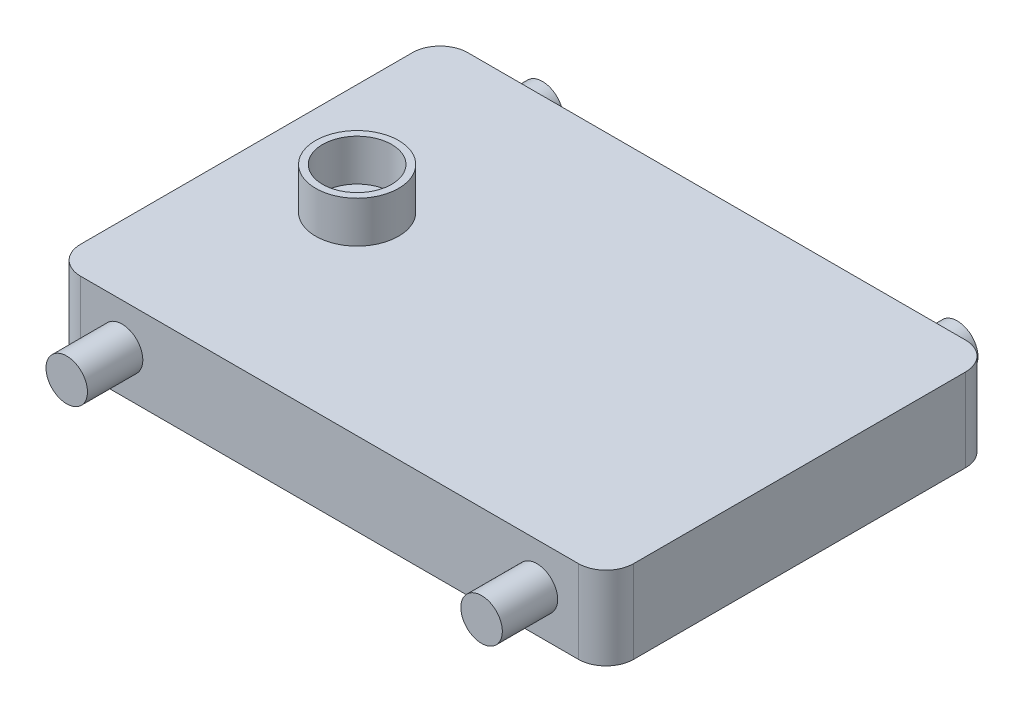
ISO-10303-21;
HEADER;
FILE_DESCRIPTION(('STEP AP214'),'2;1');
FILE_NAME('part.step','',(''),(''),'','','');
FILE_SCHEMA(('AUTOMOTIVE_DESIGN { 1 0 10303 214 1 1 1 1 }'));
ENDSEC;
DATA;
#1=APPLICATION_CONTEXT('core data for automotive mechanical design processes');
#2=APPLICATION_PROTOCOL_DEFINITION('international standard','automotive_design',2000,#1);
#3=PRODUCT_CONTEXT('',#1,'mechanical');
#4=PRODUCT('Part','Part','',(#3));
#5=PRODUCT_RELATED_PRODUCT_CATEGORY('part','',(#4));
#6=PRODUCT_DEFINITION_FORMATION('','',#4);
#7=PRODUCT_DEFINITION_CONTEXT('part definition',#1,'design');
#8=PRODUCT_DEFINITION('design','',#6,#7);
#9=PRODUCT_DEFINITION_SHAPE('','',#8);
#10=(LENGTH_UNIT() NAMED_UNIT(*) SI_UNIT(.MILLI.,.METRE.));
#11=(NAMED_UNIT(*) PLANE_ANGLE_UNIT() SI_UNIT($,.RADIAN.));
#12=(NAMED_UNIT(*) SI_UNIT($,.STERADIAN.) SOLID_ANGLE_UNIT());
#13=UNCERTAINTY_MEASURE_WITH_UNIT(LENGTH_MEASURE(1.E-05),#10,'distance_accuracy_value','');
#14=(GEOMETRIC_REPRESENTATION_CONTEXT(3) GLOBAL_UNCERTAINTY_ASSIGNED_CONTEXT((#13)) GLOBAL_UNIT_ASSIGNED_CONTEXT((#10,
#11,#12)) REPRESENTATION_CONTEXT('',''));
#15=CARTESIAN_POINT('',(0.,0.,0.));
#16=DIRECTION('',(0.,0.,1.));
#17=DIRECTION('',(1.,0.,0.));
#18=AXIS2_PLACEMENT_3D('',#15,#16,#17);
#19=CARTESIAN_POINT('',(100.,30.,70.));
#20=DIRECTION('',(-1.,0.,0.));
#21=DIRECTION('',(0.,0.,1.));
#22=AXIS2_PLACEMENT_3D('',#19,#20,#21);
#23=PLANE('',#22);
#24=DIRECTION('',(0.,0.,-1.));
#25=VECTOR('',#24,1.);
#26=CARTESIAN_POINT('',(100.,0.,70.));
#27=LINE('',#26,#25);
#28=CARTESIAN_POINT('',(100.,0.,60.));
#29=VERTEX_POINT('',#28);
#30=CARTESIAN_POINT('',(100.,0.,-60.));
#31=VERTEX_POINT('',#30);
#32=EDGE_CURVE('E128',#29,#31,#27,.T.);
#33=ORIENTED_EDGE('',*,*,#32,.T.);
#34=DIRECTION('',(0.,-1.,0.));
#35=VECTOR('',#34,1.);
#36=CARTESIAN_POINT('',(100.,30.,-60.));
#37=LINE('',#36,#35);
#38=CARTESIAN_POINT('',(100.,30.,-60.));
#39=VERTEX_POINT('',#38);
#40=EDGE_CURVE('E106',#31,#39,#37,.F.);
#41=ORIENTED_EDGE('',*,*,#40,.T.);
#42=DIRECTION('',(0.,0.,-1.));
#43=VECTOR('',#42,1.);
#44=CARTESIAN_POINT('',(100.,30.,70.));
#45=LINE('',#44,#43);
#46=CARTESIAN_POINT('',(100.,30.,60.));
#47=VERTEX_POINT('',#46);
#48=EDGE_CURVE('E138',#47,#39,#45,.T.);
#49=ORIENTED_EDGE('',*,*,#48,.F.);
#50=DIRECTION('',(0.,-1.,0.));
#51=VECTOR('',#50,1.);
#52=CARTESIAN_POINT('',(100.,30.,60.));
#53=LINE('',#52,#51);
#54=EDGE_CURVE('E111',#47,#29,#53,.T.);
#55=ORIENTED_EDGE('',*,*,#54,.T.);
#56=EDGE_LOOP('',(#33,#41,#49,#55));
#57=FACE_BOUND('',#56,.T.);
#58=ADVANCED_FACE('F33',(#57),#23,.F.);
#59=CARTESIAN_POINT('',(-100.,30.,-70.));
#60=DIRECTION('',(0.,0.,1.));
#61=DIRECTION('',(1.,0.,0.));
#62=AXIS2_PLACEMENT_3D('',#59,#60,#61);
#63=PLANE('',#62);
#64=CARTESIAN_POINT('',(-75.,15.0000000000002,-70.));
#65=DIRECTION('',(0.,0.,1.));
#66=DIRECTION('',(1.,0.,0.));
#67=AXIS2_PLACEMENT_3D('',#64,#65,#66);
#68=CIRCLE('',#67,7.50000000000001);
#69=CARTESIAN_POINT('',(-67.4999999999999,15.0000000000002,-70.));
#70=VERTEX_POINT('',#69);
#71=EDGE_CURVE('E37',#70,#70,#68,.F.);
#72=ORIENTED_EDGE('',*,*,#71,.F.);
#73=EDGE_LOOP('',(#72));
#74=FACE_BOUND('',#73,.T.);
#75=CARTESIAN_POINT('',(75.,15.,-70.));
#76=DIRECTION('',(0.,0.,1.));
#77=DIRECTION('',(1.,0.,0.));
#78=AXIS2_PLACEMENT_3D('',#75,#76,#77);
#79=CIRCLE('',#78,7.50000000000001);
#80=CARTESIAN_POINT('',(82.5,15.,-70.));
#81=VERTEX_POINT('',#80);
#82=EDGE_CURVE('E169',#81,#81,#79,.F.);
#83=ORIENTED_EDGE('',*,*,#82,.F.);
#84=EDGE_LOOP('',(#83));
#85=FACE_BOUND('',#84,.T.);
#86=DIRECTION('',(-1.,0.,0.));
#87=VECTOR('',#86,1.);
#88=CARTESIAN_POINT('',(-100.,30.,-70.));
#89=LINE('',#88,#87);
#90=CARTESIAN_POINT('',(90.,30.,-70.));
#91=VERTEX_POINT('',#90);
#92=CARTESIAN_POINT('',(-90.,30.,-70.));
#93=VERTEX_POINT('',#92);
#94=EDGE_CURVE('E121',#91,#93,#89,.T.);
#95=ORIENTED_EDGE('',*,*,#94,.F.);
#96=DIRECTION('',(0.,-1.,0.));
#97=VECTOR('',#96,1.);
#98=CARTESIAN_POINT('',(90.,30.,-70.));
#99=LINE('',#98,#97);
#100=CARTESIAN_POINT('',(90.,0.,-70.));
#101=VERTEX_POINT('',#100);
#102=EDGE_CURVE('E105',#91,#101,#99,.T.);
#103=ORIENTED_EDGE('',*,*,#102,.T.);
#104=DIRECTION('',(-1.,0.,0.));
#105=VECTOR('',#104,1.);
#106=CARTESIAN_POINT('',(-100.,0.,-70.));
#107=LINE('',#106,#105);
#108=CARTESIAN_POINT('',(-90.,0.,-70.));
#109=VERTEX_POINT('',#108);
#110=EDGE_CURVE('E118',#101,#109,#107,.T.);
#111=ORIENTED_EDGE('',*,*,#110,.T.);
#112=DIRECTION('',(0.,-1.,0.));
#113=VECTOR('',#112,1.);
#114=CARTESIAN_POINT('',(-90.,30.,-70.));
#115=LINE('',#114,#113);
#116=EDGE_CURVE('E123',#109,#93,#115,.F.);
#117=ORIENTED_EDGE('',*,*,#116,.T.);
#118=EDGE_LOOP('',(#95,#103,#111,#117));
#119=FACE_BOUND('',#118,.T.);
#120=ADVANCED_FACE('F117',(#74,#85,#119),#63,.F.);
#121=CARTESIAN_POINT('',(-100.,30.,70.));
#122=DIRECTION('',(1.,0.,0.));
#123=DIRECTION('',(0.,0.,-1.));
#124=AXIS2_PLACEMENT_3D('',#121,#122,#123);
#125=PLANE('',#124);
#126=DIRECTION('',(0.,0.,1.));
#127=VECTOR('',#126,1.);
#128=CARTESIAN_POINT('',(-100.,30.,70.));
#129=LINE('',#128,#127);
#130=CARTESIAN_POINT('',(-100.,30.,-60.));
#131=VERTEX_POINT('',#130);
#132=CARTESIAN_POINT('',(-100.,30.,60.));
#133=VERTEX_POINT('',#132);
#134=EDGE_CURVE('E214',#131,#133,#129,.T.);
#135=ORIENTED_EDGE('',*,*,#134,.F.);
#136=DIRECTION('',(0.,-1.,0.));
#137=VECTOR('',#136,1.);
#138=CARTESIAN_POINT('',(-100.,30.,-60.));
#139=LINE('',#138,#137);
#140=CARTESIAN_POINT('',(-100.,0.,-60.));
#141=VERTEX_POINT('',#140);
#142=EDGE_CURVE('E157',#131,#141,#139,.T.);
#143=ORIENTED_EDGE('',*,*,#142,.T.);
#144=DIRECTION('',(0.,0.,1.));
#145=VECTOR('',#144,1.);
#146=CARTESIAN_POINT('',(-100.,0.,70.));
#147=LINE('',#146,#145);
#148=CARTESIAN_POINT('',(-100.,0.,60.));
#149=VERTEX_POINT('',#148);
#150=EDGE_CURVE('E127',#141,#149,#147,.T.);
#151=ORIENTED_EDGE('',*,*,#150,.T.);
#152=DIRECTION('',(0.,-1.,0.));
#153=VECTOR('',#152,1.);
#154=CARTESIAN_POINT('',(-100.,30.,60.));
#155=LINE('',#154,#153);
#156=EDGE_CURVE('E155',#149,#133,#155,.F.);
#157=ORIENTED_EDGE('',*,*,#156,.T.);
#158=EDGE_LOOP('',(#135,#143,#151,#157));
#159=FACE_BOUND('',#158,.T.);
#160=ADVANCED_FACE('F180',(#159),#125,.F.);
#161=CARTESIAN_POINT('',(-100.,30.,70.));
#162=DIRECTION('',(0.,0.,-1.));
#163=DIRECTION('',(-1.,0.,0.));
#164=AXIS2_PLACEMENT_3D('',#161,#162,#163);
#165=PLANE('',#164);
#166=CARTESIAN_POINT('',(75.,15.0000000000001,70.));
#167=DIRECTION('',(0.,0.,-1.));
#168=DIRECTION('',(-1.,0.,0.));
#169=AXIS2_PLACEMENT_3D('',#166,#167,#168);
#170=CIRCLE('',#169,7.50000000000001);
#171=CARTESIAN_POINT('',(67.5,15.0000000000001,70.));
#172=VERTEX_POINT('',#171);
#173=EDGE_CURVE('E167',#172,#172,#170,.F.);
#174=ORIENTED_EDGE('',*,*,#173,.F.);
#175=EDGE_LOOP('',(#174));
#176=FACE_BOUND('',#175,.T.);
#177=CARTESIAN_POINT('',(-75.,15.,70.));
#178=DIRECTION('',(0.,0.,-1.));
#179=DIRECTION('',(-1.,0.,0.));
#180=AXIS2_PLACEMENT_3D('',#177,#178,#179);
#181=CIRCLE('',#180,7.50000000000001);
#182=CARTESIAN_POINT('',(-82.5,15.,70.));
#183=VERTEX_POINT('',#182);
#184=EDGE_CURVE('E164',#183,#183,#181,.F.);
#185=ORIENTED_EDGE('',*,*,#184,.F.);
#186=EDGE_LOOP('',(#185));
#187=FACE_BOUND('',#186,.T.);
#188=DIRECTION('',(1.,0.,0.));
#189=VECTOR('',#188,1.);
#190=CARTESIAN_POINT('',(-100.,30.,70.));
#191=LINE('',#190,#189);
#192=CARTESIAN_POINT('',(-90.,30.,70.));
#193=VERTEX_POINT('',#192);
#194=CARTESIAN_POINT('',(90.,30.,70.));
#195=VERTEX_POINT('',#194);
#196=EDGE_CURVE('E139',#193,#195,#191,.T.);
#197=ORIENTED_EDGE('',*,*,#196,.F.);
#198=DIRECTION('',(0.,-1.,0.));
#199=VECTOR('',#198,1.);
#200=CARTESIAN_POINT('',(-90.,30.,70.));
#201=LINE('',#200,#199);
#202=CARTESIAN_POINT('',(-90.,0.,70.));
#203=VERTEX_POINT('',#202);
#204=EDGE_CURVE('E161',#193,#203,#201,.T.);
#205=ORIENTED_EDGE('',*,*,#204,.T.);
#206=DIRECTION('',(1.,0.,0.));
#207=VECTOR('',#206,1.);
#208=CARTESIAN_POINT('',(-100.,0.,70.));
#209=LINE('',#208,#207);
#210=CARTESIAN_POINT('',(90.,0.,70.));
#211=VERTEX_POINT('',#210);
#212=EDGE_CURVE('E131',#203,#211,#209,.T.);
#213=ORIENTED_EDGE('',*,*,#212,.T.);
#214=DIRECTION('',(0.,-1.,0.));
#215=VECTOR('',#214,1.);
#216=CARTESIAN_POINT('',(90.,30.,70.));
#217=LINE('',#216,#215);
#218=EDGE_CURVE('E49',#211,#195,#217,.F.);
#219=ORIENTED_EDGE('',*,*,#218,.T.);
#220=EDGE_LOOP('',(#197,#205,#213,#219));
#221=FACE_BOUND('',#220,.T.);
#222=ADVANCED_FACE('F186',(#176,#187,#221),#165,.F.);
#223=CARTESIAN_POINT('',(0.,30.,0.));
#224=DIRECTION('',(0.,-1.,0.));
#225=DIRECTION('',(0.,0.,-1.));
#226=AXIS2_PLACEMENT_3D('',#223,#224,#225);
#227=PLANE('',#226);
#228=CARTESIAN_POINT('',(-60.,30.,0.));
#229=DIRECTION('',(0.,-1.,0.));
#230=DIRECTION('',(0.,0.,-1.));
#231=AXIS2_PLACEMENT_3D('',#228,#229,#230);
#232=CIRCLE('',#231,15.);
#233=CARTESIAN_POINT('',(-60.,30.,-15.));
#234=VERTEX_POINT('',#233);
#235=EDGE_CURVE('E299',#234,#234,#232,.T.);
#236=ORIENTED_EDGE('',*,*,#235,.T.);
#237=EDGE_LOOP('',(#236));
#238=FACE_BOUND('',#237,.T.);
#239=ORIENTED_EDGE('',*,*,#48,.T.);
#240=CARTESIAN_POINT('',(90.,30.,-60.));
#241=DIRECTION('',(0.,-1.,0.));
#242=DIRECTION('',(0.,0.,-1.));
#243=AXIS2_PLACEMENT_3D('',#240,#241,#242);
#244=CIRCLE('',#243,10.);
#245=EDGE_CURVE('E153',#39,#91,#244,.F.);
#246=ORIENTED_EDGE('',*,*,#245,.T.);
#247=ORIENTED_EDGE('',*,*,#94,.T.);
#248=CARTESIAN_POINT('',(-90.,30.,-60.));
#249=DIRECTION('',(0.,-1.,0.));
#250=DIRECTION('',(0.,0.,-1.));
#251=AXIS2_PLACEMENT_3D('',#248,#249,#250);
#252=CIRCLE('',#251,10.);
#253=EDGE_CURVE('E151',#93,#131,#252,.F.);
#254=ORIENTED_EDGE('',*,*,#253,.T.);
#255=ORIENTED_EDGE('',*,*,#134,.T.);
#256=CARTESIAN_POINT('',(-90.,30.,60.));
#257=DIRECTION('',(0.,-1.,0.));
#258=DIRECTION('',(0.,0.,-1.));
#259=AXIS2_PLACEMENT_3D('',#256,#257,#258);
#260=CIRCLE('',#259,10.);
#261=EDGE_CURVE('E56',#133,#193,#260,.F.);
#262=ORIENTED_EDGE('',*,*,#261,.T.);
#263=ORIENTED_EDGE('',*,*,#196,.T.);
#264=CARTESIAN_POINT('',(90.,30.,60.));
#265=DIRECTION('',(0.,-1.,0.));
#266=DIRECTION('',(0.,0.,-1.));
#267=AXIS2_PLACEMENT_3D('',#264,#265,#266);
#268=CIRCLE('',#267,10.);
#269=EDGE_CURVE('E148',#195,#47,#268,.F.);
#270=ORIENTED_EDGE('',*,*,#269,.T.);
#271=EDGE_LOOP('',(#239,#246,#247,#254,#255,#262,#263,#270));
#272=FACE_BOUND('',#271,.T.);
#273=ADVANCED_FACE('F219',(#238,#272),#227,.F.);
#274=CARTESIAN_POINT('',(0.,0.,0.));
#275=DIRECTION('',(0.,-1.,0.));
#276=DIRECTION('',(0.,0.,-1.));
#277=AXIS2_PLACEMENT_3D('',#274,#275,#276);
#278=PLANE('',#277);
#279=ORIENTED_EDGE('',*,*,#110,.F.);
#280=CARTESIAN_POINT('',(90.,0.,-60.));
#281=DIRECTION('',(0.,-1.,0.));
#282=DIRECTION('',(0.,0.,-1.));
#283=AXIS2_PLACEMENT_3D('',#280,#281,#282);
#284=CIRCLE('',#283,10.);
#285=EDGE_CURVE('E101',#101,#31,#284,.T.);
#286=ORIENTED_EDGE('',*,*,#285,.T.);
#287=ORIENTED_EDGE('',*,*,#32,.F.);
#288=CARTESIAN_POINT('',(90.,0.,60.));
#289=DIRECTION('',(0.,-1.,0.));
#290=DIRECTION('',(0.,0.,-1.));
#291=AXIS2_PLACEMENT_3D('',#288,#289,#290);
#292=CIRCLE('',#291,10.);
#293=EDGE_CURVE('E122',#29,#211,#292,.T.);
#294=ORIENTED_EDGE('',*,*,#293,.T.);
#295=ORIENTED_EDGE('',*,*,#212,.F.);
#296=CARTESIAN_POINT('',(-90.,0.,60.));
#297=DIRECTION('',(0.,-1.,0.));
#298=DIRECTION('',(0.,0.,-1.));
#299=AXIS2_PLACEMENT_3D('',#296,#297,#298);
#300=CIRCLE('',#299,10.);
#301=EDGE_CURVE('E142',#203,#149,#300,.T.);
#302=ORIENTED_EDGE('',*,*,#301,.T.);
#303=ORIENTED_EDGE('',*,*,#150,.F.);
#304=CARTESIAN_POINT('',(-90.,0.,-60.));
#305=DIRECTION('',(0.,-1.,0.));
#306=DIRECTION('',(0.,0.,-1.));
#307=AXIS2_PLACEMENT_3D('',#304,#305,#306);
#308=CIRCLE('',#307,10.);
#309=EDGE_CURVE('E112',#141,#109,#308,.T.);
#310=ORIENTED_EDGE('',*,*,#309,.T.);
#311=EDGE_LOOP('',(#279,#286,#287,#294,#295,#302,#303,#310));
#312=FACE_BOUND('',#311,.T.);
#313=ADVANCED_FACE('F125',(#312),#278,.T.);
#314=CARTESIAN_POINT('',(90.,30.,-60.));
#315=DIRECTION('',(0.,-1.,0.));
#316=DIRECTION('',(0.,0.,-1.));
#317=AXIS2_PLACEMENT_3D('',#314,#315,#316);
#318=CYLINDRICAL_SURFACE('',#317,10.);
#319=ORIENTED_EDGE('',*,*,#245,.F.);
#320=ORIENTED_EDGE('',*,*,#40,.F.);
#321=ORIENTED_EDGE('',*,*,#285,.F.);
#322=ORIENTED_EDGE('',*,*,#102,.F.);
#323=EDGE_LOOP('',(#319,#320,#321,#322));
#324=FACE_BOUND('',#323,.T.);
#325=ADVANCED_FACE('F104',(#324),#318,.T.);
#326=CARTESIAN_POINT('',(-90.,30.,-60.));
#327=DIRECTION('',(0.,-1.,0.));
#328=DIRECTION('',(0.,0.,-1.));
#329=AXIS2_PLACEMENT_3D('',#326,#327,#328);
#330=CYLINDRICAL_SURFACE('',#329,10.);
#331=ORIENTED_EDGE('',*,*,#253,.F.);
#332=ORIENTED_EDGE('',*,*,#116,.F.);
#333=ORIENTED_EDGE('',*,*,#309,.F.);
#334=ORIENTED_EDGE('',*,*,#142,.F.);
#335=EDGE_LOOP('',(#331,#332,#333,#334));
#336=FACE_BOUND('',#335,.T.);
#337=ADVANCED_FACE('F195',(#336),#330,.T.);
#338=CARTESIAN_POINT('',(-90.,30.,60.));
#339=DIRECTION('',(0.,-1.,0.));
#340=DIRECTION('',(0.,0.,-1.));
#341=AXIS2_PLACEMENT_3D('',#338,#339,#340);
#342=CYLINDRICAL_SURFACE('',#341,10.);
#343=ORIENTED_EDGE('',*,*,#261,.F.);
#344=ORIENTED_EDGE('',*,*,#156,.F.);
#345=ORIENTED_EDGE('',*,*,#301,.F.);
#346=ORIENTED_EDGE('',*,*,#204,.F.);
#347=EDGE_LOOP('',(#343,#344,#345,#346));
#348=FACE_BOUND('',#347,.T.);
#349=ADVANCED_FACE('F197',(#348),#342,.T.);
#350=CARTESIAN_POINT('',(90.,30.,60.));
#351=DIRECTION('',(0.,-1.,0.));
#352=DIRECTION('',(0.,0.,-1.));
#353=AXIS2_PLACEMENT_3D('',#350,#351,#352);
#354=CYLINDRICAL_SURFACE('',#353,10.);
#355=ORIENTED_EDGE('',*,*,#269,.F.);
#356=ORIENTED_EDGE('',*,*,#218,.F.);
#357=ORIENTED_EDGE('',*,*,#293,.F.);
#358=ORIENTED_EDGE('',*,*,#54,.F.);
#359=EDGE_LOOP('',(#355,#356,#357,#358));
#360=FACE_BOUND('',#359,.T.);
#361=ADVANCED_FACE('F35',(#360),#354,.T.);
#362=CARTESIAN_POINT('',(-75.,15.,90.));
#363=DIRECTION('',(0.,0.,-1.));
#364=DIRECTION('',(-1.,0.,0.));
#365=AXIS2_PLACEMENT_3D('',#362,#363,#364);
#366=CYLINDRICAL_SURFACE('',#365,7.50000000000001);
#367=CARTESIAN_POINT('',(-75.,15.,90.));
#368=DIRECTION('',(0.,0.,1.));
#369=DIRECTION('',(1.,0.,0.));
#370=AXIS2_PLACEMENT_3D('',#367,#368,#369);
#371=CIRCLE('',#370,7.50000000000001);
#372=CARTESIAN_POINT('',(-67.5,15.,90.));
#373=VERTEX_POINT('',#372);
#374=EDGE_CURVE('E133',#373,#373,#371,.T.);
#375=ORIENTED_EDGE('',*,*,#374,.F.);
#376=EDGE_LOOP('',(#375));
#377=FACE_BOUND('',#376,.T.);
#378=ORIENTED_EDGE('',*,*,#184,.T.);
#379=EDGE_LOOP('',(#378));
#380=FACE_BOUND('',#379,.T.);
#381=ADVANCED_FACE('F204',(#377,#380),#366,.T.);
#382=CARTESIAN_POINT('',(-75.,15.,90.));
#383=DIRECTION('',(0.,0.,1.));
#384=DIRECTION('',(1.,0.,0.));
#385=AXIS2_PLACEMENT_3D('',#382,#383,#384);
#386=PLANE('',#385);
#387=ORIENTED_EDGE('',*,*,#374,.T.);
#388=EDGE_LOOP('',(#387));
#389=FACE_BOUND('',#388,.T.);
#390=ADVANCED_FACE('F276',(#389),#386,.T.);
#391=CARTESIAN_POINT('',(75.,15.0000000000001,90.));
#392=DIRECTION('',(0.,0.,-1.));
#393=DIRECTION('',(-1.,0.,0.));
#394=AXIS2_PLACEMENT_3D('',#391,#392,#393);
#395=CYLINDRICAL_SURFACE('',#394,7.50000000000001);
#396=CARTESIAN_POINT('',(75.,15.0000000000001,90.));
#397=DIRECTION('',(0.,0.,1.));
#398=DIRECTION('',(-1.,0.,0.));
#399=AXIS2_PLACEMENT_3D('',#396,#397,#398);
#400=CIRCLE('',#399,7.50000000000001);
#401=CARTESIAN_POINT('',(67.5,15.0000000000001,90.));
#402=VERTEX_POINT('',#401);
#403=EDGE_CURVE('E289',#402,#402,#400,.T.);
#404=ORIENTED_EDGE('',*,*,#403,.F.);
#405=EDGE_LOOP('',(#404));
#406=FACE_BOUND('',#405,.T.);
#407=ORIENTED_EDGE('',*,*,#173,.T.);
#408=EDGE_LOOP('',(#407));
#409=FACE_BOUND('',#408,.T.);
#410=ADVANCED_FACE('F272',(#406,#409),#395,.T.);
#411=CARTESIAN_POINT('',(75.,15.0000000000001,90.));
#412=DIRECTION('',(0.,0.,-1.));
#413=DIRECTION('',(-1.,0.,0.));
#414=AXIS2_PLACEMENT_3D('',#411,#412,#413);
#415=PLANE('',#414);
#416=ORIENTED_EDGE('',*,*,#403,.T.);
#417=EDGE_LOOP('',(#416));
#418=FACE_BOUND('',#417,.T.);
#419=ADVANCED_FACE('F268',(#418),#415,.F.);
#420=CARTESIAN_POINT('',(75.,15.,-82.));
#421=DIRECTION('',(0.,0.,1.));
#422=DIRECTION('',(1.,0.,0.));
#423=AXIS2_PLACEMENT_3D('',#420,#421,#422);
#424=CYLINDRICAL_SURFACE('',#423,7.50000000000001);
#425=CARTESIAN_POINT('',(75.,15.,-82.));
#426=DIRECTION('',(0.,0.,-1.));
#427=DIRECTION('',(-1.,0.,0.));
#428=AXIS2_PLACEMENT_3D('',#425,#426,#427);
#429=CIRCLE('',#428,7.50000000000001);
#430=CARTESIAN_POINT('',(67.5,15.,-82.));
#431=VERTEX_POINT('',#430);
#432=EDGE_CURVE('E291',#431,#431,#429,.T.);
#433=ORIENTED_EDGE('',*,*,#432,.F.);
#434=EDGE_LOOP('',(#433));
#435=FACE_BOUND('',#434,.T.);
#436=ORIENTED_EDGE('',*,*,#82,.T.);
#437=EDGE_LOOP('',(#436));
#438=FACE_BOUND('',#437,.T.);
#439=ADVANCED_FACE('F264',(#435,#438),#424,.T.);
#440=CARTESIAN_POINT('',(75.,15.,-82.));
#441=DIRECTION('',(0.,0.,-1.));
#442=DIRECTION('',(-1.,0.,0.));
#443=AXIS2_PLACEMENT_3D('',#440,#441,#442);
#444=PLANE('',#443);
#445=ORIENTED_EDGE('',*,*,#432,.T.);
#446=EDGE_LOOP('',(#445));
#447=FACE_BOUND('',#446,.T.);
#448=ADVANCED_FACE('F260',(#447),#444,.T.);
#449=CARTESIAN_POINT('',(-75.,15.0000000000002,-82.));
#450=DIRECTION('',(0.,0.,1.));
#451=DIRECTION('',(1.,0.,0.));
#452=AXIS2_PLACEMENT_3D('',#449,#450,#451);
#453=CYLINDRICAL_SURFACE('',#452,7.50000000000001);
#454=CARTESIAN_POINT('',(-75.,15.0000000000002,-82.));
#455=DIRECTION('',(0.,0.,-1.));
#456=DIRECTION('',(1.,0.,0.));
#457=AXIS2_PLACEMENT_3D('',#454,#455,#456);
#458=CIRCLE('',#457,7.50000000000001);
#459=CARTESIAN_POINT('',(-67.4999999999999,15.0000000000002,-82.));
#460=VERTEX_POINT('',#459);
#461=EDGE_CURVE('E294',#460,#460,#458,.T.);
#462=ORIENTED_EDGE('',*,*,#461,.F.);
#463=EDGE_LOOP('',(#462));
#464=FACE_BOUND('',#463,.T.);
#465=ORIENTED_EDGE('',*,*,#71,.T.);
#466=EDGE_LOOP('',(#465));
#467=FACE_BOUND('',#466,.T.);
#468=ADVANCED_FACE('F176',(#464,#467),#453,.T.);
#469=CARTESIAN_POINT('',(-75.,15.0000000000002,-82.));
#470=DIRECTION('',(0.,0.,1.));
#471=DIRECTION('',(1.,0.,0.));
#472=AXIS2_PLACEMENT_3D('',#469,#470,#471);
#473=PLANE('',#472);
#474=ORIENTED_EDGE('',*,*,#461,.T.);
#475=EDGE_LOOP('',(#474));
#476=FACE_BOUND('',#475,.T.);
#477=ADVANCED_FACE('F250',(#476),#473,.F.);
#478=CARTESIAN_POINT('',(-60.,45.,0.));
#479=DIRECTION('',(0.,-1.,0.));
#480=DIRECTION('',(0.,0.,-1.));
#481=AXIS2_PLACEMENT_3D('',#478,#479,#480);
#482=CYLINDRICAL_SURFACE('',#481,15.);
#483=CARTESIAN_POINT('',(-60.,45.,0.));
#484=DIRECTION('',(0.,-1.,0.));
#485=DIRECTION('',(0.,0.,-1.));
#486=AXIS2_PLACEMENT_3D('',#483,#484,#485);
#487=CIRCLE('',#486,15.);
#488=CARTESIAN_POINT('',(-60.,45.,-15.));
#489=VERTEX_POINT('',#488);
#490=EDGE_CURVE('E300',#489,#489,#487,.T.);
#491=CARTESIAN_POINT('',(-60.,45.,-15.));
#492=CARTESIAN_POINT('',(-60.,44.84375,-15.));
#493=CARTESIAN_POINT('',(-60.,44.6875,-15.));
#494=CARTESIAN_POINT('',(-60.,44.375,-15.));
#495=CARTESIAN_POINT('',(-60.,44.21875,-15.));
#496=CARTESIAN_POINT('',(-60.,43.90625,-15.));
#497=CARTESIAN_POINT('',(-60.,43.75,-15.));
#498=CARTESIAN_POINT('',(-60.,43.4375,-15.));
#499=CARTESIAN_POINT('',(-60.,43.28125,-15.));
#500=CARTESIAN_POINT('',(-60.,42.96875,-15.));
#501=CARTESIAN_POINT('',(-60.,42.8125,-15.));
#502=CARTESIAN_POINT('',(-60.,42.5,-15.));
#503=CARTESIAN_POINT('',(-60.,42.34375,-15.));
#504=CARTESIAN_POINT('',(-60.,42.03125,-15.));
#505=CARTESIAN_POINT('',(-60.,41.875,-15.));
#506=CARTESIAN_POINT('',(-60.,41.5625,-15.));
#507=CARTESIAN_POINT('',(-60.,41.40625,-15.));
#508=CARTESIAN_POINT('',(-60.,41.09375,-15.));
#509=CARTESIAN_POINT('',(-60.,40.9375,-15.));
#510=CARTESIAN_POINT('',(-60.,40.625,-15.));
#511=CARTESIAN_POINT('',(-60.,40.46875,-15.));
#512=CARTESIAN_POINT('',(-60.,40.15625,-15.));
#513=CARTESIAN_POINT('',(-60.,40.,-15.));
#514=CARTESIAN_POINT('',(-60.,39.6875,-15.));
#515=CARTESIAN_POINT('',(-60.,39.53125,-15.));
#516=CARTESIAN_POINT('',(-60.,39.21875,-15.));
#517=CARTESIAN_POINT('',(-60.,39.0625,-15.));
#518=CARTESIAN_POINT('',(-60.,38.75,-15.));
#519=CARTESIAN_POINT('',(-60.,38.59375,-15.));
#520=CARTESIAN_POINT('',(-60.,38.28125,-15.));
#521=CARTESIAN_POINT('',(-60.,38.125,-15.));
#522=CARTESIAN_POINT('',(-60.,37.8125,-15.));
#523=CARTESIAN_POINT('',(-60.,37.65625,-15.));
#524=CARTESIAN_POINT('',(-60.,37.34375,-15.));
#525=CARTESIAN_POINT('',(-60.,37.1875,-15.));
#526=CARTESIAN_POINT('',(-60.,36.875,-15.));
#527=CARTESIAN_POINT('',(-60.,36.71875,-15.));
#528=CARTESIAN_POINT('',(-60.,36.40625,-15.));
#529=CARTESIAN_POINT('',(-60.,36.25,-15.));
#530=CARTESIAN_POINT('',(-60.,35.9375,-15.));
#531=CARTESIAN_POINT('',(-60.,35.78125,-15.));
#532=CARTESIAN_POINT('',(-60.,35.46875,-15.));
#533=CARTESIAN_POINT('',(-60.,35.3125,-15.));
#534=CARTESIAN_POINT('',(-60.,35.,-15.));
#535=CARTESIAN_POINT('',(-60.,34.84375,-15.));
#536=CARTESIAN_POINT('',(-60.,34.53125,-15.));
#537=CARTESIAN_POINT('',(-60.,34.375,-15.));
#538=CARTESIAN_POINT('',(-60.,34.0625,-15.));
#539=CARTESIAN_POINT('',(-60.,33.90625,-15.));
#540=CARTESIAN_POINT('',(-60.,33.59375,-15.));
#541=CARTESIAN_POINT('',(-60.,33.4375,-15.));
#542=CARTESIAN_POINT('',(-60.,33.125,-15.));
#543=CARTESIAN_POINT('',(-60.,32.96875,-15.));
#544=CARTESIAN_POINT('',(-60.,32.65625,-15.));
#545=CARTESIAN_POINT('',(-60.,32.5,-15.));
#546=CARTESIAN_POINT('',(-60.,32.1875,-15.));
#547=CARTESIAN_POINT('',(-60.,32.03125,-15.));
#548=CARTESIAN_POINT('',(-60.,31.71875,-15.));
#549=CARTESIAN_POINT('',(-60.,31.5625,-15.));
#550=CARTESIAN_POINT('',(-60.,31.25,-15.));
#551=CARTESIAN_POINT('',(-60.,31.09375,-15.));
#552=CARTESIAN_POINT('',(-60.,30.78125,-15.));
#553=CARTESIAN_POINT('',(-60.,30.625,-15.));
#554=CARTESIAN_POINT('',(-60.,30.3125,-15.));
#555=CARTESIAN_POINT('',(-60.,30.15625,-15.));
#556=CARTESIAN_POINT('',(-60.,30.,-15.));
#557=B_SPLINE_CURVE_WITH_KNOTS('',3,(#491,#492,#493,#494,#495,#496,#497,#498,#499,#500,#501,
#502,#503,#504,#505,#506,#507,#508,#509,#510,#511,#512,#513,#514,#515,#516,#517,#518,#519,#520,
#521,#522,#523,#524,#525,#526,#527,#528,#529,#530,#531,#532,#533,#534,#535,#536,#537,#538,#539,
#540,#541,#542,#543,#544,#545,#546,#547,#548,#549,#550,#551,#552,#553,#554,#555,#556),
.UNSPECIFIED.,.F.,.F.,(4,2,2,2,2,2,2,2,2,2,2,2,2,2,2,2,2,2,2,2,2,2,2,2,2,2,2,2,2,2,2,2,4),(0.,
0.468750000000004,0.937500000000001,1.40625,1.875,2.34375000000001,2.8125,3.28125000000001,3.75,
4.21875,4.6875,5.15625,5.62500000000001,6.09375,6.56250000000001,7.03125,7.50000000000001,
7.96875,8.43750000000001,8.90625,9.375,9.84375000000001,10.3125,10.78125,11.25,11.71875,12.1875,
12.65625,13.125,13.59375,14.0625,14.53125,15.),.UNSPECIFIED.);
#558=EDGE_CURVE('BSEAM244',#489,#234,#557,.T.);
#559=ORIENTED_EDGE('',*,*,#490,.T.);
#560=ORIENTED_EDGE('',*,*,#235,.F.);
#561=ORIENTED_EDGE('',*,*,#558,.T.);
#562=ORIENTED_EDGE('',*,*,#558,.F.);
#563=EDGE_LOOP('',(#559,#561,#560,#562));
#564=FACE_BOUND('',#563,.T.);
#565=ADVANCED_FACE('F244',(#564),#482,.T.);
#566=CARTESIAN_POINT('',(-60.,45.,0.));
#567=DIRECTION('',(0.,-1.,0.));
#568=DIRECTION('',(0.,0.,-1.));
#569=AXIS2_PLACEMENT_3D('',#566,#567,#568);
#570=CYLINDRICAL_SURFACE('',#569,12.5);
#571=CARTESIAN_POINT('',(-60.,45.,0.));
#572=DIRECTION('',(0.,-1.,0.));
#573=DIRECTION('',(0.,0.,-1.));
#574=AXIS2_PLACEMENT_3D('',#571,#572,#573);
#575=CIRCLE('',#574,12.5);
#576=CARTESIAN_POINT('',(-60.,45.,-12.5));
#577=VERTEX_POINT('',#576);
#578=EDGE_CURVE('E304',#577,#577,#575,.T.);
#579=CARTESIAN_POINT('',(-60.,30.,0.));
#580=DIRECTION('',(0.,-1.,0.));
#581=DIRECTION('',(0.,0.,-1.));
#582=AXIS2_PLACEMENT_3D('',#579,#580,#581);
#583=CIRCLE('',#582,12.5);
#584=CARTESIAN_POINT('',(-60.,30.,-12.5));
#585=VERTEX_POINT('',#584);
#586=EDGE_CURVE('E11',#585,#585,#583,.T.);
#587=CARTESIAN_POINT('',(-60.,45.,-12.5));
#588=CARTESIAN_POINT('',(-60.,44.84375,-12.5));
#589=CARTESIAN_POINT('',(-60.,44.6875,-12.5));
#590=CARTESIAN_POINT('',(-60.,44.375,-12.5));
#591=CARTESIAN_POINT('',(-60.,44.21875,-12.5));
#592=CARTESIAN_POINT('',(-60.,43.90625,-12.5));
#593=CARTESIAN_POINT('',(-60.,43.75,-12.5));
#594=CARTESIAN_POINT('',(-60.,43.4375,-12.5));
#595=CARTESIAN_POINT('',(-60.,43.28125,-12.5));
#596=CARTESIAN_POINT('',(-60.,42.96875,-12.5));
#597=CARTESIAN_POINT('',(-60.,42.8125,-12.5));
#598=CARTESIAN_POINT('',(-60.,42.5,-12.5));
#599=CARTESIAN_POINT('',(-60.,42.34375,-12.5));
#600=CARTESIAN_POINT('',(-60.,42.03125,-12.5));
#601=CARTESIAN_POINT('',(-60.,41.875,-12.5));
#602=CARTESIAN_POINT('',(-60.,41.5625,-12.5));
#603=CARTESIAN_POINT('',(-60.,41.40625,-12.5));
#604=CARTESIAN_POINT('',(-60.,41.09375,-12.5));
#605=CARTESIAN_POINT('',(-60.,40.9375,-12.5));
#606=CARTESIAN_POINT('',(-60.,40.625,-12.5));
#607=CARTESIAN_POINT('',(-60.,40.46875,-12.5));
#608=CARTESIAN_POINT('',(-60.,40.15625,-12.5));
#609=CARTESIAN_POINT('',(-60.,40.,-12.5));
#610=CARTESIAN_POINT('',(-60.,39.6875,-12.5));
#611=CARTESIAN_POINT('',(-60.,39.53125,-12.5));
#612=CARTESIAN_POINT('',(-60.,39.21875,-12.5));
#613=CARTESIAN_POINT('',(-60.,39.0625,-12.5));
#614=CARTESIAN_POINT('',(-60.,38.75,-12.5));
#615=CARTESIAN_POINT('',(-60.,38.59375,-12.5));
#616=CARTESIAN_POINT('',(-60.,38.28125,-12.5));
#617=CARTESIAN_POINT('',(-60.,38.125,-12.5));
#618=CARTESIAN_POINT('',(-60.,37.8125,-12.5));
#619=CARTESIAN_POINT('',(-60.,37.65625,-12.5));
#620=CARTESIAN_POINT('',(-60.,37.34375,-12.5));
#621=CARTESIAN_POINT('',(-60.,37.1875,-12.5));
#622=CARTESIAN_POINT('',(-60.,36.875,-12.5));
#623=CARTESIAN_POINT('',(-60.,36.71875,-12.5));
#624=CARTESIAN_POINT('',(-60.,36.40625,-12.5));
#625=CARTESIAN_POINT('',(-60.,36.25,-12.5));
#626=CARTESIAN_POINT('',(-60.,35.9375,-12.5));
#627=CARTESIAN_POINT('',(-60.,35.78125,-12.5));
#628=CARTESIAN_POINT('',(-60.,35.46875,-12.5));
#629=CARTESIAN_POINT('',(-60.,35.3125,-12.5));
#630=CARTESIAN_POINT('',(-60.,35.,-12.5));
#631=CARTESIAN_POINT('',(-60.,34.84375,-12.5));
#632=CARTESIAN_POINT('',(-60.,34.53125,-12.5));
#633=CARTESIAN_POINT('',(-60.,34.375,-12.5));
#634=CARTESIAN_POINT('',(-60.,34.0625,-12.5));
#635=CARTESIAN_POINT('',(-60.,33.90625,-12.5));
#636=CARTESIAN_POINT('',(-60.,33.59375,-12.5));
#637=CARTESIAN_POINT('',(-60.,33.4375,-12.5));
#638=CARTESIAN_POINT('',(-60.,33.125,-12.5));
#639=CARTESIAN_POINT('',(-60.,32.96875,-12.5));
#640=CARTESIAN_POINT('',(-60.,32.65625,-12.5));
#641=CARTESIAN_POINT('',(-60.,32.5,-12.5));
#642=CARTESIAN_POINT('',(-60.,32.1875,-12.5));
#643=CARTESIAN_POINT('',(-60.,32.03125,-12.5));
#644=CARTESIAN_POINT('',(-60.,31.71875,-12.5));
#645=CARTESIAN_POINT('',(-60.,31.5625,-12.5));
#646=CARTESIAN_POINT('',(-60.,31.25,-12.5));
#647=CARTESIAN_POINT('',(-60.,31.09375,-12.5));
#648=CARTESIAN_POINT('',(-60.,30.78125,-12.5));
#649=CARTESIAN_POINT('',(-60.,30.625,-12.5));
#650=CARTESIAN_POINT('',(-60.,30.3125,-12.5));
#651=CARTESIAN_POINT('',(-60.,30.15625,-12.5));
#652=CARTESIAN_POINT('',(-60.,30.,-12.5));
#653=B_SPLINE_CURVE_WITH_KNOTS('',3,(#587,#588,#589,#590,#591,#592,#593,#594,#595,#596,#597,
#598,#599,#600,#601,#602,#603,#604,#605,#606,#607,#608,#609,#610,#611,#612,#613,#614,#615,#616,
#617,#618,#619,#620,#621,#622,#623,#624,#625,#626,#627,#628,#629,#630,#631,#632,#633,#634,#635,
#636,#637,#638,#639,#640,#641,#642,#643,#644,#645,#646,#647,#648,#649,#650,#651,#652),
.UNSPECIFIED.,.F.,.F.,(4,2,2,2,2,2,2,2,2,2,2,2,2,2,2,2,2,2,2,2,2,2,2,2,2,2,2,2,2,2,2,2,4),(0.,
0.468749999999997,0.937499999999994,1.40625,1.87499999999999,2.34375,2.8125,3.28125,3.75,
4.21874999999999,4.6875,5.15624999999999,5.625,6.09374999999999,6.5625,7.03125,7.5,7.96875,
8.4375,8.90625,9.37499999999999,9.84375,10.3125,10.78125,11.25,11.71875,12.1875,12.65625,13.125,
13.59375,14.0625,14.53125,15.),.UNSPECIFIED.);
#654=EDGE_CURVE('BSEAM238',#577,#585,#653,.T.);
#655=ORIENTED_EDGE('',*,*,#578,.F.);
#656=ORIENTED_EDGE('',*,*,#586,.T.);
#657=ORIENTED_EDGE('',*,*,#654,.T.);
#658=ORIENTED_EDGE('',*,*,#654,.F.);
#659=EDGE_LOOP('',(#655,#657,#656,#658));
#660=FACE_BOUND('',#659,.T.);
#661=ADVANCED_FACE('F238',(#660),#570,.F.);
#662=CARTESIAN_POINT('',(-60.,45.,0.));
#663=DIRECTION('',(0.,-1.,0.));
#664=DIRECTION('',(0.,0.,-1.));
#665=AXIS2_PLACEMENT_3D('',#662,#663,#664);
#666=PLANE('',#665);
#667=ORIENTED_EDGE('',*,*,#578,.T.);
#668=EDGE_LOOP('',(#667));
#669=FACE_BOUND('',#668,.T.);
#670=ORIENTED_EDGE('',*,*,#490,.F.);
#671=EDGE_LOOP('',(#670));
#672=FACE_BOUND('',#671,.T.);
#673=ADVANCED_FACE('F233',(#669,#672),#666,.F.);
#674=ORIENTED_EDGE('',*,*,#586,.F.);
#675=EDGE_LOOP('',(#674));
#676=FACE_BOUND('',#675,.T.);
#677=ADVANCED_FACE('F223',(#676),#227,.F.);
#678=CLOSED_SHELL('',(#58,#120,#160,#222,#273,#313,#325,#337,#349,#361,#381,#390,#410,#419,#439,
#448,#468,#477,#565,#661,#673,#677));
#679=MANIFOLD_SOLID_BREP('B2',#678);
#680=ADVANCED_BREP_SHAPE_REPRESENTATION('',(#18,#679),#14);
#681=SHAPE_DEFINITION_REPRESENTATION(#9,#680);
ENDSEC;
END-ISO-10303-21;
